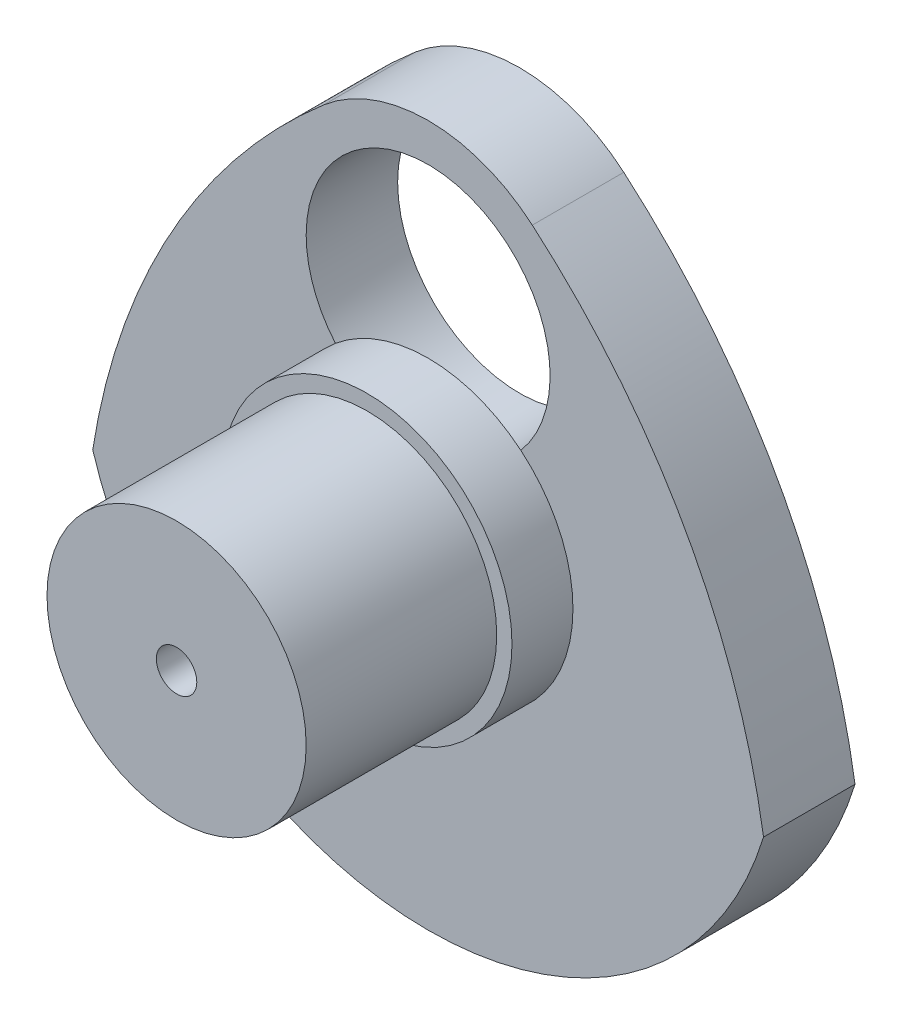
ISO-10303-21;
HEADER;
FILE_DESCRIPTION(('STEP AP214'),'2;1');
FILE_NAME('part.step','',(''),(''),'','','');
FILE_SCHEMA(('AUTOMOTIVE_DESIGN { 1 0 10303 214 1 1 1 1 }'));
ENDSEC;
DATA;
#1=APPLICATION_CONTEXT('core data for automotive mechanical design processes');
#2=APPLICATION_PROTOCOL_DEFINITION('international standard','automotive_design',2000,#1);
#3=PRODUCT_CONTEXT('',#1,'mechanical');
#4=PRODUCT('Part','Part','',(#3));
#5=PRODUCT_RELATED_PRODUCT_CATEGORY('part','',(#4));
#6=PRODUCT_DEFINITION_FORMATION('','',#4);
#7=PRODUCT_DEFINITION_CONTEXT('part definition',#1,'design');
#8=PRODUCT_DEFINITION('design','',#6,#7);
#9=PRODUCT_DEFINITION_SHAPE('','',#8);
#10=(LENGTH_UNIT() NAMED_UNIT(*) SI_UNIT(.MILLI.,.METRE.));
#11=(NAMED_UNIT(*) PLANE_ANGLE_UNIT() SI_UNIT($,.RADIAN.));
#12=(NAMED_UNIT(*) SI_UNIT($,.STERADIAN.) SOLID_ANGLE_UNIT());
#13=UNCERTAINTY_MEASURE_WITH_UNIT(LENGTH_MEASURE(1.E-05),#10,'distance_accuracy_value','');
#14=(GEOMETRIC_REPRESENTATION_CONTEXT(3) GLOBAL_UNCERTAINTY_ASSIGNED_CONTEXT((#13)) GLOBAL_UNIT_ASSIGNED_CONTEXT((#10,
#11,#12)) REPRESENTATION_CONTEXT('',''));
#15=CARTESIAN_POINT('',(0.,0.,0.));
#16=DIRECTION('',(0.,0.,1.));
#17=DIRECTION('',(1.,0.,0.));
#18=AXIS2_PLACEMENT_3D('',#15,#16,#17);
#19=CARTESIAN_POINT('',(0.,0.,25.));
#20=DIRECTION('',(0.,0.,-1.));
#21=DIRECTION('',(-1.,0.,0.));
#22=AXIS2_PLACEMENT_3D('',#19,#20,#21);
#23=CYLINDRICAL_SURFACE('',#22,17.);
#24=CARTESIAN_POINT('',(0.,0.,25.));
#25=DIRECTION('',(0.,0.,1.));
#26=DIRECTION('',(1.,0.,0.));
#27=AXIS2_PLACEMENT_3D('',#24,#25,#26);
#28=CIRCLE('',#27,17.);
#29=CARTESIAN_POINT('',(17.,0.,25.));
#30=VERTEX_POINT('',#29);
#31=EDGE_CURVE('E47',#30,#30,#28,.T.);
#32=ORIENTED_EDGE('',*,*,#31,.F.);
#33=EDGE_LOOP('',(#32));
#34=FACE_BOUND('',#33,.T.);
#35=CARTESIAN_POINT('',(0.,0.,0.));
#36=DIRECTION('',(0.,0.,1.));
#37=DIRECTION('',(1.,0.,0.));
#38=AXIS2_PLACEMENT_3D('',#35,#36,#37);
#39=CIRCLE('',#38,17.);
#40=CARTESIAN_POINT('',(17.,0.,0.));
#41=VERTEX_POINT('',#40);
#42=EDGE_CURVE('E115',#41,#41,#39,.T.);
#43=ORIENTED_EDGE('',*,*,#42,.T.);
#44=EDGE_LOOP('',(#43));
#45=FACE_BOUND('',#44,.T.);
#46=ADVANCED_FACE('F40',(#34,#45),#23,.T.);
#47=CARTESIAN_POINT('',(0.,0.,25.));
#48=DIRECTION('',(0.,0.,1.));
#49=DIRECTION('',(1.,0.,0.));
#50=AXIS2_PLACEMENT_3D('',#47,#48,#49);
#51=PLANE('',#50);
#52=CARTESIAN_POINT('',(0.,0.,25.));
#53=DIRECTION('',(0.,0.,1.));
#54=DIRECTION('',(1.,0.,0.));
#55=AXIS2_PLACEMENT_3D('',#52,#53,#54);
#56=CIRCLE('',#55,2.65);
#57=CARTESIAN_POINT('',(2.65,0.,25.));
#58=VERTEX_POINT('',#57);
#59=EDGE_CURVE('E233',#58,#58,#56,.T.);
#60=ORIENTED_EDGE('',*,*,#59,.F.);
#61=EDGE_LOOP('',(#60));
#62=FACE_BOUND('',#61,.T.);
#63=ORIENTED_EDGE('',*,*,#31,.T.);
#64=EDGE_LOOP('',(#63));
#65=FACE_BOUND('',#64,.T.);
#66=ADVANCED_FACE('F132',(#62,#65),#51,.T.);
#67=CARTESIAN_POINT('',(0.,0.,-8.));
#68=DIRECTION('',(0.,0.,1.));
#69=DIRECTION('',(1.,0.,0.));
#70=AXIS2_PLACEMENT_3D('',#67,#68,#69);
#71=CYLINDRICAL_SURFACE('',#70,19.);
#72=CARTESIAN_POINT('',(0.,0.,-8.));
#73=DIRECTION('',(0.,0.,1.));
#74=DIRECTION('',(1.,0.,0.));
#75=AXIS2_PLACEMENT_3D('',#72,#73,#74);
#76=CIRCLE('',#75,19.);
#77=CARTESIAN_POINT('',(12.1589473228565,14.6,-8.));
#78=VERTEX_POINT('',#77);
#79=CARTESIAN_POINT('',(-12.1589473228565,14.6,-8.));
#80=VERTEX_POINT('',#79);
#81=EDGE_CURVE('E101',#78,#80,#76,.T.);
#82=ORIENTED_EDGE('',*,*,#81,.T.);
#83=EDGE_CURVE('E105',#80,#78,#76,.T.);
#84=ORIENTED_EDGE('',*,*,#83,.T.);
#85=EDGE_LOOP('',(#82,#84));
#86=FACE_BOUND('',#85,.T.);
#87=CARTESIAN_POINT('',(0.,0.,0.));
#88=DIRECTION('',(0.,0.,1.));
#89=DIRECTION('',(1.,0.,0.));
#90=AXIS2_PLACEMENT_3D('',#87,#88,#89);
#91=CIRCLE('',#90,19.);
#92=CARTESIAN_POINT('',(19.,0.,0.));
#93=VERTEX_POINT('',#92);
#94=EDGE_CURVE('E113',#93,#93,#91,.T.);
#95=ORIENTED_EDGE('',*,*,#94,.F.);
#96=EDGE_LOOP('',(#95));
#97=FACE_BOUND('',#96,.T.);
#98=ADVANCED_FACE('F111',(#86,#97),#71,.T.);
#99=CARTESIAN_POINT('',(0.,0.,0.));
#100=DIRECTION('',(0.,0.,1.));
#101=DIRECTION('',(1.,0.,0.));
#102=AXIS2_PLACEMENT_3D('',#99,#100,#101);
#103=PLANE('',#102);
#104=ORIENTED_EDGE('',*,*,#42,.F.);
#105=EDGE_LOOP('',(#104));
#106=FACE_BOUND('',#105,.T.);
#107=ORIENTED_EDGE('',*,*,#94,.T.);
#108=EDGE_LOOP('',(#107));
#109=FACE_BOUND('',#108,.T.);
#110=ADVANCED_FACE('F125',(#106,#109),#103,.T.);
#111=CARTESIAN_POINT('',(-44.9094542035734,-27.3845485151599,-20.));
#112=DIRECTION('',(0.,0.,1.));
#113=DIRECTION('',(1.,0.,0.));
#114=AXIS2_PLACEMENT_3D('',#111,#112,#113);
#115=CYLINDRICAL_SURFACE('',#114,90.);
#116=CARTESIAN_POINT('',(-44.9094542035734,-27.3845485151599,-8.));
#117=DIRECTION('',(0.,0.,-1.));
#118=DIRECTION('',(-1.,0.,0.));
#119=AXIS2_PLACEMENT_3D('',#116,#117,#118);
#120=CIRCLE('',#119,90.);
#121=CARTESIAN_POINT('',(13.6680947576093,40.9431234611356,-8.));
#122=VERTEX_POINT('',#121);
#123=CARTESIAN_POINT('',(44.,-13.4164078649987,-8.));
#124=VERTEX_POINT('',#123);
#125=EDGE_CURVE('E102',#122,#124,#120,.T.);
#126=ORIENTED_EDGE('',*,*,#125,.T.);
#127=DIRECTION('',(0.,0.,1.));
#128=VECTOR('',#127,1.);
#129=CARTESIAN_POINT('',(44.,-13.4164078649987,-20.));
#130=LINE('',#129,#128);
#131=CARTESIAN_POINT('',(44.,-13.4164078649987,-20.));
#132=VERTEX_POINT('',#131);
#133=EDGE_CURVE('E109',#132,#124,#130,.T.);
#134=ORIENTED_EDGE('',*,*,#133,.F.);
#135=CARTESIAN_POINT('',(-44.9094542035734,-27.3845485151599,-20.));
#136=DIRECTION('',(0.,0.,-1.));
#137=DIRECTION('',(-1.,0.,0.));
#138=AXIS2_PLACEMENT_3D('',#135,#136,#137);
#139=CIRCLE('',#138,90.);
#140=CARTESIAN_POINT('',(13.6680947576093,40.9431234611356,-20.));
#141=VERTEX_POINT('',#140);
#142=EDGE_CURVE('E218',#141,#132,#139,.T.);
#143=ORIENTED_EDGE('',*,*,#142,.F.);
#144=DIRECTION('',(0.,0.,1.));
#145=VECTOR('',#144,1.);
#146=CARTESIAN_POINT('',(13.6680947576093,40.9431234611356,-20.));
#147=LINE('',#146,#145);
#148=EDGE_CURVE('E208',#141,#122,#147,.T.);
#149=ORIENTED_EDGE('',*,*,#148,.T.);
#150=EDGE_LOOP('',(#126,#134,#143,#149));
#151=FACE_BOUND('',#150,.T.);
#152=ADVANCED_FACE('F128',(#151),#115,.T.);
#153=CARTESIAN_POINT('',(0.,0.,-20.));
#154=DIRECTION('',(0.,0.,1.));
#155=DIRECTION('',(1.,0.,0.));
#156=AXIS2_PLACEMENT_3D('',#153,#154,#155);
#157=CYLINDRICAL_SURFACE('',#156,46.);
#158=CARTESIAN_POINT('',(0.,0.,-8.));
#159=DIRECTION('',(0.,0.,-1.));
#160=DIRECTION('',(-1.,0.,0.));
#161=AXIS2_PLACEMENT_3D('',#158,#159,#160);
#162=CIRCLE('',#161,46.);
#163=CARTESIAN_POINT('',(-44.,-13.4164078649987,-8.));
#164=VERTEX_POINT('',#163);
#165=EDGE_CURVE('E209',#124,#164,#162,.T.);
#166=ORIENTED_EDGE('',*,*,#165,.T.);
#167=DIRECTION('',(0.,0.,1.));
#168=VECTOR('',#167,1.);
#169=CARTESIAN_POINT('',(-44.,-13.4164078649987,-20.));
#170=LINE('',#169,#168);
#171=CARTESIAN_POINT('',(-44.,-13.4164078649987,-20.));
#172=VERTEX_POINT('',#171);
#173=EDGE_CURVE('E221',#172,#164,#170,.T.);
#174=ORIENTED_EDGE('',*,*,#173,.F.);
#175=CARTESIAN_POINT('',(0.,0.,-20.));
#176=DIRECTION('',(0.,0.,-1.));
#177=DIRECTION('',(-1.,0.,0.));
#178=AXIS2_PLACEMENT_3D('',#175,#176,#177);
#179=CIRCLE('',#178,46.);
#180=EDGE_CURVE('E91',#132,#172,#179,.T.);
#181=ORIENTED_EDGE('',*,*,#180,.F.);
#182=ORIENTED_EDGE('',*,*,#133,.T.);
#183=EDGE_LOOP('',(#166,#174,#181,#182));
#184=FACE_BOUND('',#183,.T.);
#185=ADVANCED_FACE('F196',(#184),#157,.T.);
#186=CARTESIAN_POINT('',(44.9094542035734,-27.3845485151599,-20.));
#187=DIRECTION('',(0.,0.,1.));
#188=DIRECTION('',(1.,0.,0.));
#189=AXIS2_PLACEMENT_3D('',#186,#187,#188);
#190=CYLINDRICAL_SURFACE('',#189,90.);
#191=CARTESIAN_POINT('',(44.9094542035734,-27.3845485151599,-8.));
#192=DIRECTION('',(0.,0.,-1.));
#193=DIRECTION('',(1.,0.,0.));
#194=AXIS2_PLACEMENT_3D('',#191,#192,#193);
#195=CIRCLE('',#194,90.);
#196=CARTESIAN_POINT('',(-13.6680947576093,40.9431234611356,-8.));
#197=VERTEX_POINT('',#196);
#198=EDGE_CURVE('E211',#164,#197,#195,.T.);
#199=ORIENTED_EDGE('',*,*,#198,.T.);
#200=DIRECTION('',(0.,0.,1.));
#201=VECTOR('',#200,1.);
#202=CARTESIAN_POINT('',(-13.6680947576093,40.9431234611356,-20.));
#203=LINE('',#202,#201);
#204=CARTESIAN_POINT('',(-13.6680947576093,40.9431234611356,-20.));
#205=VERTEX_POINT('',#204);
#206=EDGE_CURVE('E220',#205,#197,#203,.T.);
#207=ORIENTED_EDGE('',*,*,#206,.F.);
#208=CARTESIAN_POINT('',(44.9094542035734,-27.3845485151599,-20.));
#209=DIRECTION('',(0.,0.,-1.));
#210=DIRECTION('',(1.,0.,0.));
#211=AXIS2_PLACEMENT_3D('',#208,#209,#210);
#212=CIRCLE('',#211,90.);
#213=EDGE_CURVE('E226',#172,#205,#212,.T.);
#214=ORIENTED_EDGE('',*,*,#213,.F.);
#215=ORIENTED_EDGE('',*,*,#173,.T.);
#216=EDGE_LOOP('',(#199,#207,#214,#215));
#217=FACE_BOUND('',#216,.T.);
#218=ADVANCED_FACE('F193',(#217),#190,.T.);
#219=CARTESIAN_POINT('',(0.,25.,-20.));
#220=DIRECTION('',(0.,0.,1.));
#221=DIRECTION('',(1.,0.,0.));
#222=AXIS2_PLACEMENT_3D('',#219,#220,#221);
#223=CYLINDRICAL_SURFACE('',#222,21.);
#224=CARTESIAN_POINT('',(0.,25.,-8.));
#225=DIRECTION('',(0.,0.,-1.));
#226=DIRECTION('',(-1.,0.,0.));
#227=AXIS2_PLACEMENT_3D('',#224,#225,#226);
#228=CIRCLE('',#227,21.);
#229=EDGE_CURVE('E83',#197,#122,#228,.T.);
#230=ORIENTED_EDGE('',*,*,#229,.T.);
#231=ORIENTED_EDGE('',*,*,#148,.F.);
#232=CARTESIAN_POINT('',(0.,25.,-20.));
#233=DIRECTION('',(0.,0.,-1.));
#234=DIRECTION('',(-1.,0.,0.));
#235=AXIS2_PLACEMENT_3D('',#232,#233,#234);
#236=CIRCLE('',#235,21.);
#237=EDGE_CURVE('E62',#205,#141,#236,.T.);
#238=ORIENTED_EDGE('',*,*,#237,.F.);
#239=ORIENTED_EDGE('',*,*,#206,.T.);
#240=EDGE_LOOP('',(#230,#231,#238,#239));
#241=FACE_BOUND('',#240,.T.);
#242=ADVANCED_FACE('F187',(#241),#223,.T.);
#243=CARTESIAN_POINT('',(-22.4547271017867,-13.69227425758,-20.));
#244=DIRECTION('',(0.,0.,-1.));
#245=DIRECTION('',(-1.,0.,0.));
#246=AXIS2_PLACEMENT_3D('',#243,#244,#245);
#247=PLANE('',#246);
#248=CARTESIAN_POINT('',(0.,25.,-20.));
#249=DIRECTION('',(0.,0.,-1.));
#250=DIRECTION('',(-1.,0.,0.));
#251=AXIS2_PLACEMENT_3D('',#248,#249,#250);
#252=CIRCLE('',#251,16.);
#253=CARTESIAN_POINT('',(-16.,25.,-20.));
#254=VERTEX_POINT('',#253);
#255=EDGE_CURVE('E103',#254,#254,#252,.T.);
#256=ORIENTED_EDGE('',*,*,#255,.F.);
#257=EDGE_LOOP('',(#256));
#258=FACE_BOUND('',#257,.T.);
#259=ORIENTED_EDGE('',*,*,#142,.T.);
#260=ORIENTED_EDGE('',*,*,#180,.T.);
#261=ORIENTED_EDGE('',*,*,#213,.T.);
#262=ORIENTED_EDGE('',*,*,#237,.T.);
#263=EDGE_LOOP('',(#259,#260,#261,#262));
#264=FACE_BOUND('',#263,.T.);
#265=ADVANCED_FACE('F184',(#258,#264),#247,.T.);
#266=CARTESIAN_POINT('',(-22.4547271017867,-13.69227425758,-8.));
#267=DIRECTION('',(0.,0.,-1.));
#268=DIRECTION('',(-1.,0.,0.));
#269=AXIS2_PLACEMENT_3D('',#266,#267,#268);
#270=PLANE('',#269);
#271=ORIENTED_EDGE('',*,*,#83,.F.);
#272=CARTESIAN_POINT('',(0.,25.,-8.));
#273=DIRECTION('',(0.,0.,-1.));
#274=DIRECTION('',(-1.,0.,0.));
#275=AXIS2_PLACEMENT_3D('',#272,#273,#274);
#276=CIRCLE('',#275,16.);
#277=EDGE_CURVE('E11',#80,#78,#276,.T.);
#278=ORIENTED_EDGE('',*,*,#277,.T.);
#279=EDGE_LOOP('',(#271,#278));
#280=FACE_BOUND('',#279,.T.);
#281=ORIENTED_EDGE('',*,*,#125,.F.);
#282=ORIENTED_EDGE('',*,*,#229,.F.);
#283=ORIENTED_EDGE('',*,*,#198,.F.);
#284=ORIENTED_EDGE('',*,*,#165,.F.);
#285=EDGE_LOOP('',(#281,#282,#283,#284));
#286=FACE_BOUND('',#285,.T.);
#287=ADVANCED_FACE('F106',(#280,#286),#270,.F.);
#288=CARTESIAN_POINT('',(0.,25.,-8.));
#289=DIRECTION('',(0.,0.,-1.));
#290=DIRECTION('',(-1.,0.,0.));
#291=AXIS2_PLACEMENT_3D('',#288,#289,#290);
#292=CYLINDRICAL_SURFACE('',#291,16.);
#293=CARTESIAN_POINT('',(0.,25.,-8.));
#294=DIRECTION('',(0.,0.,-1.));
#295=DIRECTION('',(-1.,0.,0.));
#296=AXIS2_PLACEMENT_3D('',#293,#294,#295);
#297=CIRCLE('',#296,16.);
#298=EDGE_CURVE('E53',#78,#80,#297,.T.);
#299=ORIENTED_EDGE('',*,*,#298,.F.);
#300=ORIENTED_EDGE('',*,*,#277,.F.);
#301=EDGE_LOOP('',(#299,#300));
#302=FACE_BOUND('',#301,.T.);
#303=ORIENTED_EDGE('',*,*,#255,.T.);
#304=EDGE_LOOP('',(#303));
#305=FACE_BOUND('',#304,.T.);
#306=ADVANCED_FACE('F93',(#302,#305),#292,.F.);
#307=CARTESIAN_POINT('',(0.,25.,-8.));
#308=DIRECTION('',(0.,0.,-1.));
#309=DIRECTION('',(-1.,0.,0.));
#310=AXIS2_PLACEMENT_3D('',#307,#308,#309);
#311=PLANE('',#310);
#312=ORIENTED_EDGE('',*,*,#298,.T.);
#313=ORIENTED_EDGE('',*,*,#81,.F.);
#314=EDGE_LOOP('',(#312,#313));
#315=FACE_BOUND('',#314,.T.);
#316=ADVANCED_FACE('F99',(#315),#311,.T.);
#317=CARTESIAN_POINT('',(0.,0.,10.));
#318=DIRECTION('',(0.,0.,1.));
#319=DIRECTION('',(1.,0.,0.));
#320=AXIS2_PLACEMENT_3D('',#317,#318,#319);
#321=CYLINDRICAL_SURFACE('',#320,2.65);
#322=CARTESIAN_POINT('',(0.,0.,10.));
#323=DIRECTION('',(0.,0.,1.));
#324=DIRECTION('',(1.,0.,0.));
#325=AXIS2_PLACEMENT_3D('',#322,#323,#324);
#326=CIRCLE('',#325,2.65);
#327=CARTESIAN_POINT('',(2.65,0.,10.));
#328=VERTEX_POINT('',#327);
#329=EDGE_CURVE('E231',#328,#328,#326,.T.);
#330=ORIENTED_EDGE('',*,*,#329,.F.);
#331=EDGE_LOOP('',(#330));
#332=FACE_BOUND('',#331,.T.);
#333=ORIENTED_EDGE('',*,*,#59,.T.);
#334=EDGE_LOOP('',(#333));
#335=FACE_BOUND('',#334,.T.);
#336=ADVANCED_FACE('F160',(#332,#335),#321,.F.);
#337=CARTESIAN_POINT('',(0.,0.,10.));
#338=DIRECTION('',(0.,0.,1.));
#339=DIRECTION('',(1.,0.,0.));
#340=AXIS2_PLACEMENT_3D('',#337,#338,#339);
#341=PLANE('',#340);
#342=ORIENTED_EDGE('',*,*,#329,.T.);
#343=EDGE_LOOP('',(#342));
#344=FACE_BOUND('',#343,.T.);
#345=ADVANCED_FACE('F165',(#344),#341,.T.);
#346=CLOSED_SHELL('',(#46,#66,#98,#110,#152,#185,#218,#242,#265,#287,#306,#316,#336,#345));
#347=MANIFOLD_SOLID_BREP('B2',#346);
#348=ADVANCED_BREP_SHAPE_REPRESENTATION('',(#18,#347),#14);
#349=SHAPE_DEFINITION_REPRESENTATION(#9,#348);
ENDSEC;
END-ISO-10303-21;
